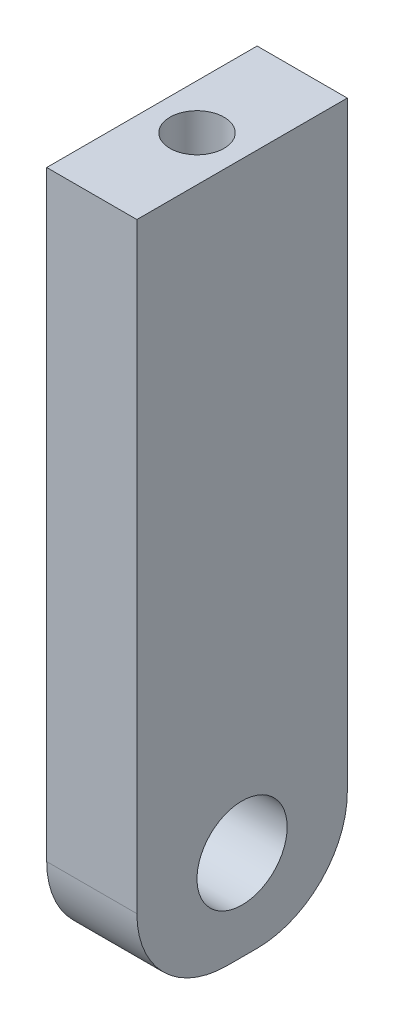
ISO-10303-21;
HEADER;
FILE_DESCRIPTION(('STEP AP214'),'2;1');
FILE_NAME('part.step','',(''),(''),'','','');
FILE_SCHEMA(('AUTOMOTIVE_DESIGN { 1 0 10303 214 1 1 1 1 }'));
ENDSEC;
DATA;
#1=APPLICATION_CONTEXT('core data for automotive mechanical design processes');
#2=APPLICATION_PROTOCOL_DEFINITION('international standard','automotive_design',2000,#1);
#3=PRODUCT_CONTEXT('',#1,'mechanical');
#4=PRODUCT('Part','Part','',(#3));
#5=PRODUCT_RELATED_PRODUCT_CATEGORY('part','',(#4));
#6=PRODUCT_DEFINITION_FORMATION('','',#4);
#7=PRODUCT_DEFINITION_CONTEXT('part definition',#1,'design');
#8=PRODUCT_DEFINITION('design','',#6,#7);
#9=PRODUCT_DEFINITION_SHAPE('','',#8);
#10=(LENGTH_UNIT() NAMED_UNIT(*) SI_UNIT(.MILLI.,.METRE.));
#11=(NAMED_UNIT(*) PLANE_ANGLE_UNIT() SI_UNIT($,.RADIAN.));
#12=(NAMED_UNIT(*) SI_UNIT($,.STERADIAN.) SOLID_ANGLE_UNIT());
#13=UNCERTAINTY_MEASURE_WITH_UNIT(LENGTH_MEASURE(1.E-05),#10,'distance_accuracy_value','');
#14=(GEOMETRIC_REPRESENTATION_CONTEXT(3) GLOBAL_UNCERTAINTY_ASSIGNED_CONTEXT((#13)) GLOBAL_UNIT_ASSIGNED_CONTEXT((#10,
#11,#12)) REPRESENTATION_CONTEXT('',''));
#15=CARTESIAN_POINT('',(0.,0.,0.));
#16=DIRECTION('',(0.,0.,1.));
#17=DIRECTION('',(1.,0.,0.));
#18=AXIS2_PLACEMENT_3D('',#15,#16,#17);
#19=CARTESIAN_POINT('',(3.,0.546254549383258,7.));
#20=DIRECTION('',(0.,-1.,0.));
#21=DIRECTION('',(1.,0.,0.));
#22=AXIS2_PLACEMENT_3D('',#19,#20,#21);
#23=PLANE('',#22);
#24=CARTESIAN_POINT('',(1.5,0.546254549383257,3.5));
#25=DIRECTION('',(0.,1.,0.));
#26=DIRECTION('',(-1.,0.,0.));
#27=AXIS2_PLACEMENT_3D('',#24,#25,#26);
#28=CIRCLE('',#27,0.9);
#29=CARTESIAN_POINT('',(0.6,0.546254549383257,3.5));
#30=VERTEX_POINT('',#29);
#31=EDGE_CURVE('E193',#30,#30,#28,.T.);
#32=ORIENTED_EDGE('',*,*,#31,.F.);
#33=EDGE_LOOP('',(#32));
#34=FACE_BOUND('',#33,.T.);
#35=DIRECTION('',(-1.,0.,0.));
#36=VECTOR('',#35,1.);
#37=CARTESIAN_POINT('',(3.,0.546254549383258,0.));
#38=LINE('',#37,#36);
#39=CARTESIAN_POINT('',(3.,0.546254549383258,0.));
#40=VERTEX_POINT('',#39);
#41=CARTESIAN_POINT('',(0.,0.546254549383257,0.));
#42=VERTEX_POINT('',#41);
#43=EDGE_CURVE('E115',#40,#42,#38,.T.);
#44=ORIENTED_EDGE('',*,*,#43,.T.);
#45=DIRECTION('',(0.,0.,-1.));
#46=VECTOR('',#45,1.);
#47=CARTESIAN_POINT('',(0.,0.546254549383257,7.));
#48=LINE('',#47,#46);
#49=CARTESIAN_POINT('',(0.,0.546254549383257,7.));
#50=VERTEX_POINT('',#49);
#51=EDGE_CURVE('E97',#50,#42,#48,.T.);
#52=ORIENTED_EDGE('',*,*,#51,.F.);
#53=DIRECTION('',(-1.,0.,0.));
#54=VECTOR('',#53,1.);
#55=CARTESIAN_POINT('',(3.,0.546254549383258,7.));
#56=LINE('',#55,#54);
#57=CARTESIAN_POINT('',(3.,0.546254549383258,7.));
#58=VERTEX_POINT('',#57);
#59=EDGE_CURVE('E104',#58,#50,#56,.T.);
#60=ORIENTED_EDGE('',*,*,#59,.F.);
#61=DIRECTION('',(0.,0.,-1.));
#62=VECTOR('',#61,1.);
#63=CARTESIAN_POINT('',(3.,0.546254549383258,7.));
#64=LINE('',#63,#62);
#65=EDGE_CURVE('E143',#58,#40,#64,.T.);
#66=ORIENTED_EDGE('',*,*,#65,.T.);
#67=EDGE_LOOP('',(#44,#52,#60,#66));
#68=FACE_BOUND('',#67,.T.);
#69=ADVANCED_FACE('F41',(#34,#68),#23,.F.);
#70=CARTESIAN_POINT('',(0.,0.546254549383257,7.));
#71=DIRECTION('',(1.,0.,0.));
#72=DIRECTION('',(0.,1.,0.));
#73=AXIS2_PLACEMENT_3D('',#70,#71,#72);
#74=PLANE('',#73);
#75=CARTESIAN_POINT('',(0.,-19.4537454506167,3.5));
#76=DIRECTION('',(1.,0.,0.));
#77=DIRECTION('',(0.,0.,-1.));
#78=AXIS2_PLACEMENT_3D('',#75,#76,#77);
#79=CIRCLE('',#78,1.5);
#80=CARTESIAN_POINT('',(0.,-19.4537454506167,2.));
#81=VERTEX_POINT('',#80);
#82=EDGE_CURVE('E149',#81,#81,#79,.T.);
#83=ORIENTED_EDGE('',*,*,#82,.T.);
#84=EDGE_LOOP('',(#83));
#85=FACE_BOUND('',#84,.T.);
#86=DIRECTION('',(0.,0.,-1.));
#87=VECTOR('',#86,1.);
#88=CARTESIAN_POINT('',(0.,-22.4537454506167,7.));
#89=LINE('',#88,#87);
#90=CARTESIAN_POINT('',(0.,-22.4537454506167,4.));
#91=VERTEX_POINT('',#90);
#92=CARTESIAN_POINT('',(0.,-22.4537454506167,3.));
#93=VERTEX_POINT('',#92);
#94=EDGE_CURVE('E117',#91,#93,#89,.T.);
#95=ORIENTED_EDGE('',*,*,#94,.F.);
#96=CARTESIAN_POINT('',(0.,-19.4537454506167,4.));
#97=DIRECTION('',(1.,0.,0.));
#98=DIRECTION('',(0.,1.,0.));
#99=AXIS2_PLACEMENT_3D('',#96,#97,#98);
#100=CIRCLE('',#99,3.);
#101=CARTESIAN_POINT('',(0.,-19.4537454506167,7.));
#102=VERTEX_POINT('',#101);
#103=EDGE_CURVE('E49',#91,#102,#100,.F.);
#104=ORIENTED_EDGE('',*,*,#103,.T.);
#105=DIRECTION('',(0.,-1.,0.));
#106=VECTOR('',#105,1.);
#107=CARTESIAN_POINT('',(0.,0.546254549383257,7.));
#108=LINE('',#107,#106);
#109=EDGE_CURVE('E93',#50,#102,#108,.T.);
#110=ORIENTED_EDGE('',*,*,#109,.F.);
#111=ORIENTED_EDGE('',*,*,#51,.T.);
#112=DIRECTION('',(0.,-1.,0.));
#113=VECTOR('',#112,1.);
#114=CARTESIAN_POINT('',(0.,0.546254549383257,0.));
#115=LINE('',#114,#113);
#116=CARTESIAN_POINT('',(0.,-19.4537454506167,0.));
#117=VERTEX_POINT('',#116);
#118=EDGE_CURVE('E148',#42,#117,#115,.T.);
#119=ORIENTED_EDGE('',*,*,#118,.T.);
#120=CARTESIAN_POINT('',(0.,-19.4537454506167,3.));
#121=DIRECTION('',(1.,0.,0.));
#122=DIRECTION('',(0.,1.,0.));
#123=AXIS2_PLACEMENT_3D('',#120,#121,#122);
#124=CIRCLE('',#123,3.);
#125=EDGE_CURVE('E61',#117,#93,#124,.F.);
#126=ORIENTED_EDGE('',*,*,#125,.T.);
#127=EDGE_LOOP('',(#95,#104,#110,#111,#119,#126));
#128=FACE_BOUND('',#127,.T.);
#129=ADVANCED_FACE('F95',(#85,#128),#74,.F.);
#130=CARTESIAN_POINT('',(0.,-22.4537454506167,7.));
#131=DIRECTION('',(0.,1.,0.));
#132=DIRECTION('',(0.,0.,1.));
#133=AXIS2_PLACEMENT_3D('',#130,#131,#132);
#134=PLANE('',#133);
#135=DIRECTION('',(0.,0.,-1.));
#136=VECTOR('',#135,1.);
#137=CARTESIAN_POINT('',(3.,-22.4537454506167,7.));
#138=LINE('',#137,#136);
#139=CARTESIAN_POINT('',(3.,-22.4537454506167,4.));
#140=VERTEX_POINT('',#139);
#141=CARTESIAN_POINT('',(3.,-22.4537454506167,3.));
#142=VERTEX_POINT('',#141);
#143=EDGE_CURVE('E121',#140,#142,#138,.T.);
#144=ORIENTED_EDGE('',*,*,#143,.F.);
#145=DIRECTION('',(1.,0.,0.));
#146=VECTOR('',#145,1.);
#147=CARTESIAN_POINT('',(0.,-22.4537454506167,4.));
#148=LINE('',#147,#146);
#149=EDGE_CURVE('E131',#140,#91,#148,.F.);
#150=ORIENTED_EDGE('',*,*,#149,.T.);
#151=ORIENTED_EDGE('',*,*,#94,.T.);
#152=DIRECTION('',(1.,0.,0.));
#153=VECTOR('',#152,1.);
#154=CARTESIAN_POINT('',(0.,-22.4537454506167,3.));
#155=LINE('',#154,#153);
#156=EDGE_CURVE('E128',#93,#142,#155,.T.);
#157=ORIENTED_EDGE('',*,*,#156,.T.);
#158=EDGE_LOOP('',(#144,#150,#151,#157));
#159=FACE_BOUND('',#158,.T.);
#160=ADVANCED_FACE('F136',(#159),#134,.F.);
#161=CARTESIAN_POINT('',(3.,-22.4537454506167,7.));
#162=DIRECTION('',(-1.,0.,0.));
#163=DIRECTION('',(0.,0.,1.));
#164=AXIS2_PLACEMENT_3D('',#161,#162,#163);
#165=PLANE('',#164);
#166=CARTESIAN_POINT('',(3.,-19.4537454506167,3.5));
#167=DIRECTION('',(1.,0.,0.));
#168=DIRECTION('',(0.,0.,-1.));
#169=AXIS2_PLACEMENT_3D('',#166,#167,#168);
#170=CIRCLE('',#169,1.5);
#171=CARTESIAN_POINT('',(3.,-19.4537454506167,2.));
#172=VERTEX_POINT('',#171);
#173=EDGE_CURVE('E192',#172,#172,#170,.T.);
#174=ORIENTED_EDGE('',*,*,#173,.F.);
#175=EDGE_LOOP('',(#174));
#176=FACE_BOUND('',#175,.T.);
#177=DIRECTION('',(0.,1.,0.));
#178=VECTOR('',#177,1.);
#179=CARTESIAN_POINT('',(3.,-22.4537454506167,7.));
#180=LINE('',#179,#178);
#181=CARTESIAN_POINT('',(3.,-19.4537454506167,7.));
#182=VERTEX_POINT('',#181);
#183=EDGE_CURVE('E103',#182,#58,#180,.T.);
#184=ORIENTED_EDGE('',*,*,#183,.F.);
#185=CARTESIAN_POINT('',(3.,-19.4537454506167,4.));
#186=DIRECTION('',(-1.,0.,0.));
#187=DIRECTION('',(0.,0.,1.));
#188=AXIS2_PLACEMENT_3D('',#185,#186,#187);
#189=CIRCLE('',#188,3.);
#190=EDGE_CURVE('E126',#182,#140,#189,.F.);
#191=ORIENTED_EDGE('',*,*,#190,.T.);
#192=ORIENTED_EDGE('',*,*,#143,.T.);
#193=CARTESIAN_POINT('',(3.,-19.4537454506167,3.));
#194=DIRECTION('',(-1.,0.,0.));
#195=DIRECTION('',(0.,0.,1.));
#196=AXIS2_PLACEMENT_3D('',#193,#194,#195);
#197=CIRCLE('',#196,3.);
#198=CARTESIAN_POINT('',(3.,-19.4537454506167,0.));
#199=VERTEX_POINT('',#198);
#200=EDGE_CURVE('E119',#142,#199,#197,.F.);
#201=ORIENTED_EDGE('',*,*,#200,.T.);
#202=DIRECTION('',(0.,1.,0.));
#203=VECTOR('',#202,1.);
#204=CARTESIAN_POINT('',(3.,-22.4537454506167,0.));
#205=LINE('',#204,#203);
#206=EDGE_CURVE('E112',#199,#40,#205,.T.);
#207=ORIENTED_EDGE('',*,*,#206,.T.);
#208=ORIENTED_EDGE('',*,*,#65,.F.);
#209=EDGE_LOOP('',(#184,#191,#192,#201,#207,#208));
#210=FACE_BOUND('',#209,.T.);
#211=ADVANCED_FACE('F142',(#176,#210),#165,.F.);
#212=CARTESIAN_POINT('',(0.,0.,7.));
#213=DIRECTION('',(0.,0.,1.));
#214=DIRECTION('',(1.,0.,0.));
#215=AXIS2_PLACEMENT_3D('',#212,#213,#214);
#216=PLANE('',#215);
#217=ORIENTED_EDGE('',*,*,#109,.T.);
#218=DIRECTION('',(1.,0.,0.));
#219=VECTOR('',#218,1.);
#220=CARTESIAN_POINT('',(3.,-19.4537454506167,7.));
#221=LINE('',#220,#219);
#222=EDGE_CURVE('E116',#102,#182,#221,.T.);
#223=ORIENTED_EDGE('',*,*,#222,.T.);
#224=ORIENTED_EDGE('',*,*,#183,.T.);
#225=ORIENTED_EDGE('',*,*,#59,.T.);
#226=EDGE_LOOP('',(#217,#223,#224,#225));
#227=FACE_BOUND('',#226,.T.);
#228=ADVANCED_FACE('F107',(#227),#216,.T.);
#229=CARTESIAN_POINT('',(0.,0.,0.));
#230=DIRECTION('',(0.,0.,1.));
#231=DIRECTION('',(1.,0.,0.));
#232=AXIS2_PLACEMENT_3D('',#229,#230,#231);
#233=PLANE('',#232);
#234=ORIENTED_EDGE('',*,*,#206,.F.);
#235=DIRECTION('',(1.,0.,0.));
#236=VECTOR('',#235,1.);
#237=CARTESIAN_POINT('',(0.,-19.4537454506167,0.));
#238=LINE('',#237,#236);
#239=EDGE_CURVE('E11',#199,#117,#238,.F.);
#240=ORIENTED_EDGE('',*,*,#239,.T.);
#241=ORIENTED_EDGE('',*,*,#118,.F.);
#242=ORIENTED_EDGE('',*,*,#43,.F.);
#243=EDGE_LOOP('',(#234,#240,#241,#242));
#244=FACE_BOUND('',#243,.T.);
#245=ADVANCED_FACE('F152',(#244),#233,.F.);
#246=CARTESIAN_POINT('',(0.,-19.4537454506167,3.5));
#247=DIRECTION('',(1.,0.,0.));
#248=DIRECTION('',(0.,0.,-1.));
#249=AXIS2_PLACEMENT_3D('',#246,#247,#248);
#250=CYLINDRICAL_SURFACE('',#249,1.5);
#251=CARTESIAN_POINT('',(0.,-19.4537454506167,2.));
#252=CARTESIAN_POINT('',(0.0312499999999995,-19.4537454506167,2.));
#253=CARTESIAN_POINT('',(0.0624999999999996,-19.4537454506167,2.));
#254=CARTESIAN_POINT('',(0.125,-19.4537454506167,2.));
#255=CARTESIAN_POINT('',(0.15625,-19.4537454506167,2.));
#256=CARTESIAN_POINT('',(0.21875,-19.4537454506167,2.));
#257=CARTESIAN_POINT('',(0.25,-19.4537454506167,2.));
#258=CARTESIAN_POINT('',(0.3125,-19.4537454506167,2.));
#259=CARTESIAN_POINT('',(0.34375,-19.4537454506167,2.));
#260=CARTESIAN_POINT('',(0.40625,-19.4537454506167,2.));
#261=CARTESIAN_POINT('',(0.4375,-19.4537454506167,2.));
#262=CARTESIAN_POINT('',(0.5,-19.4537454506167,2.));
#263=CARTESIAN_POINT('',(0.53125,-19.4537454506167,2.));
#264=CARTESIAN_POINT('',(0.59375,-19.4537454506167,2.));
#265=CARTESIAN_POINT('',(0.625,-19.4537454506167,2.));
#266=CARTESIAN_POINT('',(0.6875,-19.4537454506167,2.));
#267=CARTESIAN_POINT('',(0.71875,-19.4537454506167,2.));
#268=CARTESIAN_POINT('',(0.78125,-19.4537454506167,2.));
#269=CARTESIAN_POINT('',(0.8125,-19.4537454506167,2.));
#270=CARTESIAN_POINT('',(0.875,-19.4537454506167,2.));
#271=CARTESIAN_POINT('',(0.90625,-19.4537454506167,2.));
#272=CARTESIAN_POINT('',(0.96875,-19.4537454506167,2.));
#273=CARTESIAN_POINT('',(1.,-19.4537454506167,2.));
#274=CARTESIAN_POINT('',(1.0625,-19.4537454506167,2.));
#275=CARTESIAN_POINT('',(1.09375,-19.4537454506167,2.));
#276=CARTESIAN_POINT('',(1.15625,-19.4537454506167,2.));
#277=CARTESIAN_POINT('',(1.1875,-19.4537454506167,2.));
#278=CARTESIAN_POINT('',(1.25,-19.4537454506167,2.));
#279=CARTESIAN_POINT('',(1.28125,-19.4537454506167,2.));
#280=CARTESIAN_POINT('',(1.34375,-19.4537454506167,2.));
#281=CARTESIAN_POINT('',(1.375,-19.4537454506167,2.));
#282=CARTESIAN_POINT('',(1.4375,-19.4537454506167,2.));
#283=CARTESIAN_POINT('',(1.46875,-19.4537454506167,2.));
#284=CARTESIAN_POINT('',(1.53125,-19.4537454506167,2.));
#285=CARTESIAN_POINT('',(1.5625,-19.4537454506167,2.));
#286=CARTESIAN_POINT('',(1.625,-19.4537454506167,2.));
#287=CARTESIAN_POINT('',(1.65625,-19.4537454506167,2.));
#288=CARTESIAN_POINT('',(1.71875,-19.4537454506167,2.));
#289=CARTESIAN_POINT('',(1.75,-19.4537454506167,2.));
#290=CARTESIAN_POINT('',(1.8125,-19.4537454506167,2.));
#291=CARTESIAN_POINT('',(1.84375,-19.4537454506167,2.));
#292=CARTESIAN_POINT('',(1.90625,-19.4537454506167,2.));
#293=CARTESIAN_POINT('',(1.9375,-19.4537454506167,2.));
#294=CARTESIAN_POINT('',(2.,-19.4537454506167,2.));
#295=CARTESIAN_POINT('',(2.03125,-19.4537454506167,2.));
#296=CARTESIAN_POINT('',(2.09375,-19.4537454506167,2.));
#297=CARTESIAN_POINT('',(2.125,-19.4537454506167,2.));
#298=CARTESIAN_POINT('',(2.1875,-19.4537454506167,2.));
#299=CARTESIAN_POINT('',(2.21875,-19.4537454506167,2.));
#300=CARTESIAN_POINT('',(2.28125,-19.4537454506167,2.));
#301=CARTESIAN_POINT('',(2.3125,-19.4537454506167,2.));
#302=CARTESIAN_POINT('',(2.375,-19.4537454506167,2.));
#303=CARTESIAN_POINT('',(2.40625,-19.4537454506167,2.));
#304=CARTESIAN_POINT('',(2.46875,-19.4537454506167,2.));
#305=CARTESIAN_POINT('',(2.5,-19.4537454506167,2.));
#306=CARTESIAN_POINT('',(2.5625,-19.4537454506167,2.));
#307=CARTESIAN_POINT('',(2.59375,-19.4537454506167,2.));
#308=CARTESIAN_POINT('',(2.65625,-19.4537454506167,2.));
#309=CARTESIAN_POINT('',(2.6875,-19.4537454506167,2.));
#310=CARTESIAN_POINT('',(2.75,-19.4537454506167,2.));
#311=CARTESIAN_POINT('',(2.78125,-19.4537454506167,2.));
#312=CARTESIAN_POINT('',(2.84375,-19.4537454506167,2.));
#313=CARTESIAN_POINT('',(2.875,-19.4537454506167,2.));
#314=CARTESIAN_POINT('',(2.9375,-19.4537454506167,2.));
#315=CARTESIAN_POINT('',(2.96875,-19.4537454506167,2.));
#316=CARTESIAN_POINT('',(3.,-19.4537454506167,2.));
#317=B_SPLINE_CURVE_WITH_KNOTS('',3,(#251,#252,#253,#254,#255,#256,#257,#258,#259,#260,#261,
#262,#263,#264,#265,#266,#267,#268,#269,#270,#271,#272,#273,#274,#275,#276,#277,#278,#279,#280,
#281,#282,#283,#284,#285,#286,#287,#288,#289,#290,#291,#292,#293,#294,#295,#296,#297,#298,#299,
#300,#301,#302,#303,#304,#305,#306,#307,#308,#309,#310,#311,#312,#313,#314,#315,#316),
.UNSPECIFIED.,.F.,.F.,(4,2,2,2,2,2,2,2,2,2,2,2,2,2,2,2,2,2,2,2,2,2,2,2,2,2,2,2,2,2,2,2,4),(0.,
0.09375,0.1875,0.28125,0.375,0.46875,0.5625,0.65625,0.75,0.84375,0.9375,1.03125,1.125,1.21875,
1.3125,1.40625,1.5,1.59375,1.6875,1.78125,1.875,1.96875,2.0625,2.15625,2.25,2.34375,2.4375,
2.53125,2.625,2.71875,2.8125,2.90625,3.),.UNSPECIFIED.);
#318=EDGE_CURVE('BSEAM163',#81,#172,#317,.T.);
#319=ORIENTED_EDGE('',*,*,#82,.F.);
#320=ORIENTED_EDGE('',*,*,#173,.T.);
#321=ORIENTED_EDGE('',*,*,#318,.T.);
#322=ORIENTED_EDGE('',*,*,#318,.F.);
#323=EDGE_LOOP('',(#319,#321,#320,#322));
#324=FACE_BOUND('',#323,.T.);
#325=ADVANCED_FACE('F163',(#324),#250,.F.);
#326=CARTESIAN_POINT('',(0.,-19.4537454506167,4.));
#327=DIRECTION('',(-1.,0.,0.));
#328=DIRECTION('',(0.,0.,1.));
#329=AXIS2_PLACEMENT_3D('',#326,#327,#328);
#330=CYLINDRICAL_SURFACE('',#329,3.);
#331=ORIENTED_EDGE('',*,*,#103,.F.);
#332=ORIENTED_EDGE('',*,*,#149,.F.);
#333=ORIENTED_EDGE('',*,*,#190,.F.);
#334=ORIENTED_EDGE('',*,*,#222,.F.);
#335=EDGE_LOOP('',(#331,#332,#333,#334));
#336=FACE_BOUND('',#335,.T.);
#337=ADVANCED_FACE('F140',(#336),#330,.T.);
#338=CARTESIAN_POINT('',(0.,-19.4537454506167,3.));
#339=DIRECTION('',(1.,0.,0.));
#340=DIRECTION('',(0.,0.,-1.));
#341=AXIS2_PLACEMENT_3D('',#338,#339,#340);
#342=CYLINDRICAL_SURFACE('',#341,3.);
#343=ORIENTED_EDGE('',*,*,#125,.F.);
#344=ORIENTED_EDGE('',*,*,#239,.F.);
#345=ORIENTED_EDGE('',*,*,#200,.F.);
#346=ORIENTED_EDGE('',*,*,#156,.F.);
#347=EDGE_LOOP('',(#343,#344,#345,#346));
#348=FACE_BOUND('',#347,.T.);
#349=ADVANCED_FACE('F43',(#348),#342,.T.);
#350=CARTESIAN_POINT('',(1.5,-6.45374545061674,3.5));
#351=DIRECTION('',(0.,1.,0.));
#352=DIRECTION('',(-1.,0.,0.));
#353=AXIS2_PLACEMENT_3D('',#350,#351,#352);
#354=CYLINDRICAL_SURFACE('',#353,0.9);
#355=CARTESIAN_POINT('',(1.5,-6.45374545061674,3.5));
#356=DIRECTION('',(0.,1.,0.));
#357=DIRECTION('',(-1.,0.,0.));
#358=AXIS2_PLACEMENT_3D('',#355,#356,#357);
#359=CIRCLE('',#358,0.9);
#360=CARTESIAN_POINT('',(0.600000000000001,-6.45374545061674,3.5));
#361=VERTEX_POINT('',#360);
#362=EDGE_CURVE('E191',#361,#361,#359,.T.);
#363=ORIENTED_EDGE('',*,*,#362,.F.);
#364=EDGE_LOOP('',(#363));
#365=FACE_BOUND('',#364,.T.);
#366=ORIENTED_EDGE('',*,*,#31,.T.);
#367=EDGE_LOOP('',(#366));
#368=FACE_BOUND('',#367,.T.);
#369=ADVANCED_FACE('F154',(#365,#368),#354,.F.);
#370=CARTESIAN_POINT('',(1.5,-6.45374545061674,3.5));
#371=DIRECTION('',(0.,1.,0.));
#372=DIRECTION('',(-1.,0.,0.));
#373=AXIS2_PLACEMENT_3D('',#370,#371,#372);
#374=PLANE('',#373);
#375=ORIENTED_EDGE('',*,*,#362,.T.);
#376=EDGE_LOOP('',(#375));
#377=FACE_BOUND('',#376,.T.);
#378=ADVANCED_FACE('F160',(#377),#374,.T.);
#379=CLOSED_SHELL('',(#69,#129,#160,#211,#228,#245,#325,#337,#349,#369,#378));
#380=MANIFOLD_SOLID_BREP('B2',#379);
#381=ADVANCED_BREP_SHAPE_REPRESENTATION('',(#18,#380),#14);
#382=SHAPE_DEFINITION_REPRESENTATION(#9,#381);
ENDSEC;
END-ISO-10303-21;
